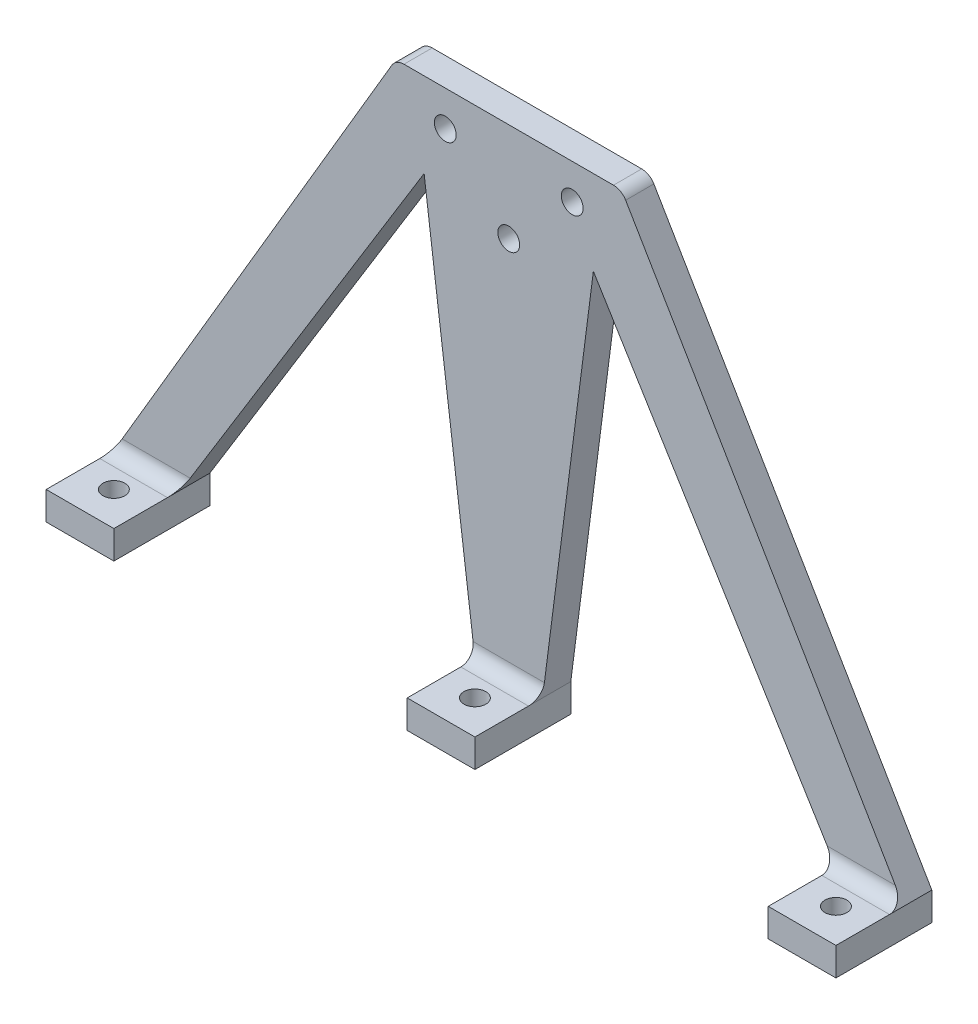
ISO-10303-21;
HEADER;
FILE_DESCRIPTION(('STEP AP214'),'2;1');
FILE_NAME('part.step','',(''),(''),'','','');
FILE_SCHEMA(('AUTOMOTIVE_DESIGN { 1 0 10303 214 1 1 1 1 }'));
ENDSEC;
DATA;
#1=APPLICATION_CONTEXT('core data for automotive mechanical design processes');
#2=APPLICATION_PROTOCOL_DEFINITION('international standard','automotive_design',2000,#1);
#3=PRODUCT_CONTEXT('',#1,'mechanical');
#4=PRODUCT('Part','Part','',(#3));
#5=PRODUCT_RELATED_PRODUCT_CATEGORY('part','',(#4));
#6=PRODUCT_DEFINITION_FORMATION('','',#4);
#7=PRODUCT_DEFINITION_CONTEXT('part definition',#1,'design');
#8=PRODUCT_DEFINITION('design','',#6,#7);
#9=PRODUCT_DEFINITION_SHAPE('','',#8);
#10=(LENGTH_UNIT() NAMED_UNIT(*) SI_UNIT(.MILLI.,.METRE.));
#11=(NAMED_UNIT(*) PLANE_ANGLE_UNIT() SI_UNIT($,.RADIAN.));
#12=(NAMED_UNIT(*) SI_UNIT($,.STERADIAN.) SOLID_ANGLE_UNIT());
#13=UNCERTAINTY_MEASURE_WITH_UNIT(LENGTH_MEASURE(1.E-05),#10,'distance_accuracy_value','');
#14=(GEOMETRIC_REPRESENTATION_CONTEXT(3) GLOBAL_UNCERTAINTY_ASSIGNED_CONTEXT((#13)) GLOBAL_UNIT_ASSIGNED_CONTEXT((#10,
#11,#12)) REPRESENTATION_CONTEXT('',''));
#15=CARTESIAN_POINT('',(0.,0.,0.));
#16=DIRECTION('',(0.,0.,1.));
#17=DIRECTION('',(1.,0.,0.));
#18=AXIS2_PLACEMENT_3D('',#15,#16,#17);
#19=CARTESIAN_POINT('',(0.,-72.,4.));
#20=DIRECTION('',(0.,1.,0.));
#21=DIRECTION('',(0.,0.,1.));
#22=AXIS2_PLACEMENT_3D('',#19,#20,#21);
#23=PLANE('',#22);
#24=CARTESIAN_POINT('',(56.,-72.,8.8));
#25=DIRECTION('',(0.,1.,0.));
#26=DIRECTION('',(0.,0.,1.));
#27=AXIS2_PLACEMENT_3D('',#24,#25,#26);
#28=CIRCLE('',#27,1.54999999999999);
#29=CARTESIAN_POINT('',(56.,-72.,10.35));
#30=VERTEX_POINT('',#29);
#31=EDGE_CURVE('E263',#30,#30,#28,.T.);
#32=ORIENTED_EDGE('',*,*,#31,.T.);
#33=EDGE_LOOP('',(#32));
#34=FACE_BOUND('',#33,.T.);
#35=DIRECTION('',(1.,0.,0.));
#36=VECTOR('',#35,1.);
#37=CARTESIAN_POINT('',(0.,-72.,0.));
#38=LINE('',#37,#36);
#39=CARTESIAN_POINT('',(51.2,-72.,0.));
#40=VERTEX_POINT('',#39);
#41=CARTESIAN_POINT('',(60.8,-72.,0.));
#42=VERTEX_POINT('',#41);
#43=EDGE_CURVE('E344',#40,#42,#38,.T.);
#44=ORIENTED_EDGE('',*,*,#43,.T.);
#45=DIRECTION('',(0.,0.,-1.));
#46=VECTOR('',#45,1.);
#47=CARTESIAN_POINT('',(60.8,-72.,13.6));
#48=LINE('',#47,#46);
#49=CARTESIAN_POINT('',(60.8,-72.,13.6));
#50=VERTEX_POINT('',#49);
#51=EDGE_CURVE('E293',#50,#42,#48,.T.);
#52=ORIENTED_EDGE('',*,*,#51,.F.);
#53=DIRECTION('',(1.,0.,0.));
#54=VECTOR('',#53,1.);
#55=CARTESIAN_POINT('',(51.2,-72.,13.6));
#56=LINE('',#55,#54);
#57=CARTESIAN_POINT('',(51.2,-72.,13.6));
#58=VERTEX_POINT('',#57);
#59=EDGE_CURVE('E281',#58,#50,#56,.T.);
#60=ORIENTED_EDGE('',*,*,#59,.F.);
#61=DIRECTION('',(0.,0.,-1.));
#62=VECTOR('',#61,1.);
#63=CARTESIAN_POINT('',(51.2,-72.,13.6));
#64=LINE('',#63,#62);
#65=EDGE_CURVE('E295',#58,#40,#64,.T.);
#66=ORIENTED_EDGE('',*,*,#65,.T.);
#67=EDGE_LOOP('',(#44,#52,#60,#66));
#68=FACE_BOUND('',#67,.T.);
#69=ADVANCED_FACE('F33',(#34,#68),#23,.F.);
#70=CARTESIAN_POINT('',(4.80000000000001,-72.,8.8));
#71=DIRECTION('',(0.,1.,0.));
#72=DIRECTION('',(0.,0.,1.));
#73=AXIS2_PLACEMENT_3D('',#70,#71,#72);
#74=CIRCLE('',#73,1.55);
#75=CARTESIAN_POINT('',(4.80000000000001,-72.,10.35));
#76=VERTEX_POINT('',#75);
#77=EDGE_CURVE('E275',#76,#76,#74,.T.);
#78=ORIENTED_EDGE('',*,*,#77,.T.);
#79=EDGE_LOOP('',(#78));
#80=FACE_BOUND('',#79,.T.);
#81=CARTESIAN_POINT('',(0.,-72.,0.));
#82=VERTEX_POINT('',#81);
#83=CARTESIAN_POINT('',(9.60000000000001,-72.,0.));
#84=VERTEX_POINT('',#83);
#85=EDGE_CURVE('E340',#82,#84,#38,.T.);
#86=ORIENTED_EDGE('',*,*,#85,.T.);
#87=DIRECTION('',(0.,0.,-1.));
#88=VECTOR('',#87,1.);
#89=CARTESIAN_POINT('',(9.60000000000001,-72.,13.6));
#90=LINE('',#89,#88);
#91=CARTESIAN_POINT('',(9.60000000000001,-72.,13.6));
#92=VERTEX_POINT('',#91);
#93=EDGE_CURVE('E330',#92,#84,#90,.T.);
#94=ORIENTED_EDGE('',*,*,#93,.F.);
#95=DIRECTION('',(1.,0.,0.));
#96=VECTOR('',#95,1.);
#97=CARTESIAN_POINT('',(0.,-72.,13.6));
#98=LINE('',#97,#96);
#99=CARTESIAN_POINT('',(0.,-72.,13.6));
#100=VERTEX_POINT('',#99);
#101=EDGE_CURVE('E318',#100,#92,#98,.T.);
#102=ORIENTED_EDGE('',*,*,#101,.F.);
#103=DIRECTION('',(0.,0.,-1.));
#104=VECTOR('',#103,1.);
#105=CARTESIAN_POINT('',(0.,-72.,4.));
#106=LINE('',#105,#104);
#107=EDGE_CURVE('E350',#100,#82,#106,.T.);
#108=ORIENTED_EDGE('',*,*,#107,.T.);
#109=EDGE_LOOP('',(#86,#94,#102,#108));
#110=FACE_BOUND('',#109,.T.);
#111=ADVANCED_FACE('F517',(#80,#110),#23,.F.);
#112=CARTESIAN_POINT('',(0.,0.,4.));
#113=DIRECTION('',(0.,0.,1.));
#114=DIRECTION('',(1.,0.,0.));
#115=AXIS2_PLACEMENT_3D('',#112,#113,#114);
#116=PLANE('',#115);
#117=DIRECTION('',(0.507020126563394,-0.861934215157769,0.));
#118=VECTOR('',#117,1.);
#119=CARTESIAN_POINT('',(72.,0.,4.));
#120=LINE('',#119,#118);
#121=CARTESIAN_POINT('',(72.5799763216901,-0.985959746873217,4.));
#122=VERTEX_POINT('',#121);
#123=CARTESIAN_POINT('',(110.823529411765,-66.,4.));
#124=VERTEX_POINT('',#123);
#125=EDGE_CURVE('E236',#122,#124,#120,.T.);
#126=ORIENTED_EDGE('',*,*,#125,.F.);
#127=CARTESIAN_POINT('',(70.8561078913746,-2.,4.));
#128=DIRECTION('',(0.,0.,1.));
#129=DIRECTION('',(1.,0.,0.));
#130=AXIS2_PLACEMENT_3D('',#127,#128,#129);
#131=CIRCLE('',#130,2.);
#132=CARTESIAN_POINT('',(70.8561078913746,0.,4.));
#133=VERTEX_POINT('',#132);
#134=EDGE_CURVE('E416',#122,#133,#131,.T.);
#135=ORIENTED_EDGE('',*,*,#134,.T.);
#136=DIRECTION('',(-1.,0.,0.));
#137=VECTOR('',#136,1.);
#138=CARTESIAN_POINT('',(0.,0.,4.));
#139=LINE('',#138,#137);
#140=CARTESIAN_POINT('',(41.1438921086254,0.,4.));
#141=VERTEX_POINT('',#140);
#142=EDGE_CURVE('E333',#133,#141,#139,.T.);
#143=ORIENTED_EDGE('',*,*,#142,.T.);
#144=CARTESIAN_POINT('',(41.1438921086254,-2.,4.));
#145=DIRECTION('',(0.,0.,1.));
#146=DIRECTION('',(1.,0.,0.));
#147=AXIS2_PLACEMENT_3D('',#144,#145,#146);
#148=CIRCLE('',#147,2.);
#149=CARTESIAN_POINT('',(39.4200236783099,-0.98595974687321,4.));
#150=VERTEX_POINT('',#149);
#151=EDGE_CURVE('E414',#141,#150,#148,.T.);
#152=ORIENTED_EDGE('',*,*,#151,.T.);
#153=DIRECTION('',(0.507020126563394,0.86193421515777,0.));
#154=VECTOR('',#153,1.);
#155=CARTESIAN_POINT('',(40.,0.,4.));
#156=LINE('',#155,#154);
#157=CARTESIAN_POINT('',(1.1764705882353,-66.,4.));
#158=VERTEX_POINT('',#157);
#159=EDGE_CURVE('E244',#158,#150,#156,.T.);
#160=ORIENTED_EDGE('',*,*,#159,.F.);
#161=DIRECTION('',(-1.,0.,0.));
#162=VECTOR('',#161,1.);
#163=CARTESIAN_POINT('',(0.,-66.,4.));
#164=LINE('',#163,#162);
#165=CARTESIAN_POINT('',(10.8285714285714,-66.,4.));
#166=VERTEX_POINT('',#165);
#167=EDGE_CURVE('E387',#158,#166,#164,.F.);
#168=ORIENTED_EDGE('',*,*,#167,.T.);
#169=DIRECTION('',(-0.523418105874801,-0.852075986307815,0.));
#170=VECTOR('',#169,1.);
#171=CARTESIAN_POINT('',(9.60000000000001,-68.,4.));
#172=LINE('',#171,#170);
#173=CARTESIAN_POINT('',(44.,-12.,4.));
#174=VERTEX_POINT('',#173);
#175=EDGE_CURVE('E230',#174,#166,#172,.T.);
#176=ORIENTED_EDGE('',*,*,#175,.F.);
#177=DIRECTION('',(-0.127521742539526,0.991835775307426,0.));
#178=VECTOR('',#177,1.);
#179=CARTESIAN_POINT('',(44.,-12.,4.));
#180=LINE('',#179,#178);
#181=CARTESIAN_POINT('',(50.9428571428572,-66.,4.));
#182=VERTEX_POINT('',#181);
#183=EDGE_CURVE('E227',#182,#174,#180,.T.);
#184=ORIENTED_EDGE('',*,*,#183,.F.);
#185=DIRECTION('',(-1.,0.,0.));
#186=VECTOR('',#185,1.);
#187=CARTESIAN_POINT('',(0.,-66.,4.));
#188=LINE('',#187,#186);
#189=CARTESIAN_POINT('',(61.0571428571429,-66.,4.));
#190=VERTEX_POINT('',#189);
#191=EDGE_CURVE('E223',#182,#190,#188,.F.);
#192=ORIENTED_EDGE('',*,*,#191,.T.);
#193=DIRECTION('',(-0.127521742539526,-0.991835775307426,0.));
#194=VECTOR('',#193,1.);
#195=CARTESIAN_POINT('',(68.,-12.,4.));
#196=LINE('',#195,#194);
#197=CARTESIAN_POINT('',(68.,-12.,4.));
#198=VERTEX_POINT('',#197);
#199=EDGE_CURVE('E205',#198,#190,#196,.T.);
#200=ORIENTED_EDGE('',*,*,#199,.F.);
#201=DIRECTION('',(-0.523418105874801,0.852075986307815,0.));
#202=VECTOR('',#201,1.);
#203=CARTESIAN_POINT('',(102.4,-68.,4.));
#204=LINE('',#203,#202);
#205=CARTESIAN_POINT('',(101.171428571429,-66.,4.));
#206=VERTEX_POINT('',#205);
#207=EDGE_CURVE('E194',#206,#198,#204,.T.);
#208=ORIENTED_EDGE('',*,*,#207,.F.);
#209=DIRECTION('',(-1.,0.,0.));
#210=VECTOR('',#209,1.);
#211=CARTESIAN_POINT('',(0.,-66.,4.));
#212=LINE('',#211,#210);
#213=EDGE_CURVE('E390',#206,#124,#212,.F.);
#214=ORIENTED_EDGE('',*,*,#213,.T.);
#215=EDGE_LOOP('',(#126,#135,#143,#152,#160,#168,#176,#184,#192,#200,#208,#214));
#216=FACE_BOUND('',#215,.T.);
#217=CARTESIAN_POINT('',(65.,-5.00000000000001,4.));
#218=DIRECTION('',(0.,0.,1.));
#219=DIRECTION('',(1.,0.,0.));
#220=AXIS2_PLACEMENT_3D('',#217,#218,#219);
#221=CIRCLE('',#220,1.54999999999999);
#222=CARTESIAN_POINT('',(66.55,-5.00000000000001,4.));
#223=VERTEX_POINT('',#222);
#224=EDGE_CURVE('E249',#223,#223,#221,.T.);
#225=ORIENTED_EDGE('',*,*,#224,.F.);
#226=EDGE_LOOP('',(#225));
#227=FACE_BOUND('',#226,.T.);
#228=CARTESIAN_POINT('',(56.,-14.,4.));
#229=DIRECTION('',(0.,0.,1.));
#230=DIRECTION('',(1.,0.,0.));
#231=AXIS2_PLACEMENT_3D('',#228,#229,#230);
#232=CIRCLE('',#231,1.55);
#233=CARTESIAN_POINT('',(57.55,-14.,4.));
#234=VERTEX_POINT('',#233);
#235=EDGE_CURVE('E248',#234,#234,#232,.T.);
#236=ORIENTED_EDGE('',*,*,#235,.F.);
#237=EDGE_LOOP('',(#236));
#238=FACE_BOUND('',#237,.T.);
#239=CARTESIAN_POINT('',(47.,-5.00000000000001,4.));
#240=DIRECTION('',(0.,0.,1.));
#241=DIRECTION('',(1.,0.,0.));
#242=AXIS2_PLACEMENT_3D('',#239,#240,#241);
#243=CIRCLE('',#242,1.55);
#244=CARTESIAN_POINT('',(48.55,-5.00000000000001,4.));
#245=VERTEX_POINT('',#244);
#246=EDGE_CURVE('E255',#245,#245,#243,.T.);
#247=ORIENTED_EDGE('',*,*,#246,.F.);
#248=EDGE_LOOP('',(#247));
#249=FACE_BOUND('',#248,.T.);
#250=ADVANCED_FACE('F219',(#216,#227,#238,#249),#116,.T.);
#251=CARTESIAN_POINT('',(0.,0.,4.));
#252=DIRECTION('',(1.,0.,0.));
#253=DIRECTION('',(0.,1.,0.));
#254=AXIS2_PLACEMENT_3D('',#251,#252,#253);
#255=PLANE('',#254);
#256=DIRECTION('',(0.,0.,-1.));
#257=VECTOR('',#256,1.);
#258=CARTESIAN_POINT('',(0.,-68.,13.6));
#259=LINE('',#258,#257);
#260=CARTESIAN_POINT('',(0.,-68.,13.6));
#261=VERTEX_POINT('',#260);
#262=CARTESIAN_POINT('',(0.,-68.,6.));
#263=VERTEX_POINT('',#262);
#264=EDGE_CURVE('E324',#261,#263,#259,.T.);
#265=ORIENTED_EDGE('',*,*,#264,.T.);
#266=DIRECTION('',(0.,0.,1.));
#267=VECTOR('',#266,1.);
#268=CARTESIAN_POINT('',(0.,-68.,-5.6));
#269=LINE('',#268,#267);
#270=CARTESIAN_POINT('',(0.,-68.,0.));
#271=VERTEX_POINT('',#270);
#272=EDGE_CURVE('E246',#271,#263,#269,.T.);
#273=ORIENTED_EDGE('',*,*,#272,.F.);
#274=DIRECTION('',(0.,-1.,0.));
#275=VECTOR('',#274,1.);
#276=CARTESIAN_POINT('',(0.,0.,0.));
#277=LINE('',#276,#275);
#278=EDGE_CURVE('E332',#271,#82,#277,.T.);
#279=ORIENTED_EDGE('',*,*,#278,.T.);
#280=ORIENTED_EDGE('',*,*,#107,.F.);
#281=DIRECTION('',(0.,-1.,0.));
#282=VECTOR('',#281,1.);
#283=CARTESIAN_POINT('',(0.,-72.,13.6));
#284=LINE('',#283,#282);
#285=EDGE_CURVE('E315',#261,#100,#284,.T.);
#286=ORIENTED_EDGE('',*,*,#285,.F.);
#287=EDGE_LOOP('',(#265,#273,#279,#280,#286));
#288=FACE_BOUND('',#287,.T.);
#289=ADVANCED_FACE('F455',(#288),#255,.F.);
#290=CARTESIAN_POINT('',(107.2,-72.,8.8));
#291=DIRECTION('',(0.,1.,0.));
#292=DIRECTION('',(0.,0.,1.));
#293=AXIS2_PLACEMENT_3D('',#290,#291,#292);
#294=CIRCLE('',#293,1.54999999999999);
#295=CARTESIAN_POINT('',(107.2,-72.,10.35));
#296=VERTEX_POINT('',#295);
#297=EDGE_CURVE('E269',#296,#296,#294,.T.);
#298=ORIENTED_EDGE('',*,*,#297,.T.);
#299=EDGE_LOOP('',(#298));
#300=FACE_BOUND('',#299,.T.);
#301=DIRECTION('',(0.,0.,-1.));
#302=VECTOR('',#301,1.);
#303=CARTESIAN_POINT('',(102.4,-72.,13.6));
#304=LINE('',#303,#302);
#305=CARTESIAN_POINT('',(102.4,-72.,13.6));
#306=VERTEX_POINT('',#305);
#307=CARTESIAN_POINT('',(102.4,-72.,0.));
#308=VERTEX_POINT('',#307);
#309=EDGE_CURVE('E313',#306,#308,#304,.T.);
#310=ORIENTED_EDGE('',*,*,#309,.T.);
#311=CARTESIAN_POINT('',(112.,-72.,0.));
#312=VERTEX_POINT('',#311);
#313=EDGE_CURVE('E339',#308,#312,#38,.T.);
#314=ORIENTED_EDGE('',*,*,#313,.T.);
#315=DIRECTION('',(0.,0.,-1.));
#316=VECTOR('',#315,1.);
#317=CARTESIAN_POINT('',(112.,-72.,4.));
#318=LINE('',#317,#316);
#319=CARTESIAN_POINT('',(112.,-72.,13.6));
#320=VERTEX_POINT('',#319);
#321=EDGE_CURVE('E336',#320,#312,#318,.T.);
#322=ORIENTED_EDGE('',*,*,#321,.F.);
#323=DIRECTION('',(1.,0.,0.));
#324=VECTOR('',#323,1.);
#325=CARTESIAN_POINT('',(102.4,-72.,13.6));
#326=LINE('',#325,#324);
#327=EDGE_CURVE('E300',#306,#320,#326,.T.);
#328=ORIENTED_EDGE('',*,*,#327,.F.);
#329=EDGE_LOOP('',(#310,#314,#322,#328));
#330=FACE_BOUND('',#329,.T.);
#331=ADVANCED_FACE('F520',(#300,#330),#23,.F.);
#332=CARTESIAN_POINT('',(112.,0.,4.));
#333=DIRECTION('',(-1.,0.,0.));
#334=DIRECTION('',(0.,-1.,0.));
#335=AXIS2_PLACEMENT_3D('',#332,#333,#334);
#336=PLANE('',#335);
#337=DIRECTION('',(0.,1.,0.));
#338=VECTOR('',#337,1.);
#339=CARTESIAN_POINT('',(112.,0.,0.));
#340=LINE('',#339,#338);
#341=CARTESIAN_POINT('',(112.,-68.0000000000001,0.));
#342=VERTEX_POINT('',#341);
#343=EDGE_CURVE('E343',#312,#342,#340,.T.);
#344=ORIENTED_EDGE('',*,*,#343,.T.);
#345=DIRECTION('',(0.,0.,1.));
#346=VECTOR('',#345,1.);
#347=CARTESIAN_POINT('',(112.,-68.,-5.6));
#348=LINE('',#347,#346);
#349=CARTESIAN_POINT('',(112.,-68.,6.));
#350=VERTEX_POINT('',#349);
#351=EDGE_CURVE('E242',#342,#350,#348,.T.);
#352=ORIENTED_EDGE('',*,*,#351,.T.);
#353=DIRECTION('',(0.,0.,-1.));
#354=VECTOR('',#353,1.);
#355=CARTESIAN_POINT('',(112.,-68.,13.6));
#356=LINE('',#355,#354);
#357=CARTESIAN_POINT('',(112.,-68.,13.6));
#358=VERTEX_POINT('',#357);
#359=EDGE_CURVE('E310',#358,#350,#356,.T.);
#360=ORIENTED_EDGE('',*,*,#359,.F.);
#361=DIRECTION('',(0.,1.,0.));
#362=VECTOR('',#361,1.);
#363=CARTESIAN_POINT('',(112.,-72.,13.6));
#364=LINE('',#363,#362);
#365=EDGE_CURVE('E303',#320,#358,#364,.T.);
#366=ORIENTED_EDGE('',*,*,#365,.F.);
#367=ORIENTED_EDGE('',*,*,#321,.T.);
#368=EDGE_LOOP('',(#344,#352,#360,#366,#367));
#369=FACE_BOUND('',#368,.T.);
#370=ADVANCED_FACE('F528',(#369),#336,.F.);
#371=CARTESIAN_POINT('',(0.,0.,4.));
#372=DIRECTION('',(0.,-1.,0.));
#373=DIRECTION('',(0.,0.,-1.));
#374=AXIS2_PLACEMENT_3D('',#371,#372,#373);
#375=PLANE('',#374);
#376=ORIENTED_EDGE('',*,*,#142,.F.);
#377=DIRECTION('',(0.,0.,1.));
#378=VECTOR('',#377,1.);
#379=CARTESIAN_POINT('',(70.8561078913746,0.,4.));
#380=LINE('',#379,#378);
#381=CARTESIAN_POINT('',(70.8561078913746,0.,0.));
#382=VERTEX_POINT('',#381);
#383=EDGE_CURVE('E421',#133,#382,#380,.F.);
#384=ORIENTED_EDGE('',*,*,#383,.T.);
#385=DIRECTION('',(-1.,0.,0.));
#386=VECTOR('',#385,1.);
#387=CARTESIAN_POINT('',(0.,0.,0.));
#388=LINE('',#387,#386);
#389=CARTESIAN_POINT('',(41.1438921086254,0.,0.));
#390=VERTEX_POINT('',#389);
#391=EDGE_CURVE('E337',#382,#390,#388,.T.);
#392=ORIENTED_EDGE('',*,*,#391,.T.);
#393=DIRECTION('',(0.,0.,1.));
#394=VECTOR('',#393,1.);
#395=CARTESIAN_POINT('',(41.1438921086254,0.,4.));
#396=LINE('',#395,#394);
#397=EDGE_CURVE('E418',#390,#141,#396,.T.);
#398=ORIENTED_EDGE('',*,*,#397,.T.);
#399=EDGE_LOOP('',(#376,#384,#392,#398));
#400=FACE_BOUND('',#399,.T.);
#401=ADVANCED_FACE('F436',(#400),#375,.F.);
#402=CARTESIAN_POINT('',(0.,0.,0.));
#403=DIRECTION('',(0.,0.,1.));
#404=DIRECTION('',(1.,0.,0.));
#405=AXIS2_PLACEMENT_3D('',#402,#403,#404);
#406=PLANE('',#405);
#407=CARTESIAN_POINT('',(65.,-5.00000000000001,0.));
#408=DIRECTION('',(0.,0.,1.));
#409=DIRECTION('',(1.,0.,0.));
#410=AXIS2_PLACEMENT_3D('',#407,#408,#409);
#411=CIRCLE('',#410,1.54999999999999);
#412=CARTESIAN_POINT('',(66.55,-5.00000000000001,0.));
#413=VERTEX_POINT('',#412);
#414=EDGE_CURVE('E259',#413,#413,#411,.T.);
#415=ORIENTED_EDGE('',*,*,#414,.T.);
#416=EDGE_LOOP('',(#415));
#417=FACE_BOUND('',#416,.T.);
#418=CARTESIAN_POINT('',(56.,-14.,0.));
#419=DIRECTION('',(0.,0.,1.));
#420=DIRECTION('',(1.,0.,0.));
#421=AXIS2_PLACEMENT_3D('',#418,#419,#420);
#422=CIRCLE('',#421,1.55);
#423=CARTESIAN_POINT('',(57.55,-14.,0.));
#424=VERTEX_POINT('',#423);
#425=EDGE_CURVE('E252',#424,#424,#422,.T.);
#426=ORIENTED_EDGE('',*,*,#425,.T.);
#427=EDGE_LOOP('',(#426));
#428=FACE_BOUND('',#427,.T.);
#429=CARTESIAN_POINT('',(47.,-5.00000000000001,0.));
#430=DIRECTION('',(0.,0.,1.));
#431=DIRECTION('',(1.,0.,0.));
#432=AXIS2_PLACEMENT_3D('',#429,#430,#431);
#433=CIRCLE('',#432,1.55);
#434=CARTESIAN_POINT('',(48.55,-5.00000000000001,0.));
#435=VERTEX_POINT('',#434);
#436=EDGE_CURVE('E258',#435,#435,#433,.T.);
#437=ORIENTED_EDGE('',*,*,#436,.T.);
#438=EDGE_LOOP('',(#437));
#439=FACE_BOUND('',#438,.T.);
#440=ORIENTED_EDGE('',*,*,#391,.F.);
#441=CARTESIAN_POINT('',(70.8561078913746,-2.,0.));
#442=DIRECTION('',(0.,0.,1.));
#443=DIRECTION('',(1.,0.,0.));
#444=AXIS2_PLACEMENT_3D('',#441,#442,#443);
#445=CIRCLE('',#444,2.);
#446=CARTESIAN_POINT('',(72.5799763216901,-0.985959746873238,0.));
#447=VERTEX_POINT('',#446);
#448=EDGE_CURVE('E41',#382,#447,#445,.F.);
#449=ORIENTED_EDGE('',*,*,#448,.T.);
#450=DIRECTION('',(0.507020126563394,-0.86193421515777,0.));
#451=VECTOR('',#450,1.);
#452=CARTESIAN_POINT('',(53.4910025706941,31.46529562982,0.));
#453=LINE('',#452,#451);
#454=EDGE_CURVE('E361',#447,#342,#453,.T.);
#455=ORIENTED_EDGE('',*,*,#454,.T.);
#456=ORIENTED_EDGE('',*,*,#343,.F.);
#457=ORIENTED_EDGE('',*,*,#313,.F.);
#458=DIRECTION('',(0.,1.,0.));
#459=VECTOR('',#458,1.);
#460=CARTESIAN_POINT('',(102.4,0.,0.));
#461=LINE('',#460,#459);
#462=CARTESIAN_POINT('',(102.4,-68.,0.));
#463=VERTEX_POINT('',#462);
#464=EDGE_CURVE('E375',#308,#463,#461,.T.);
#465=ORIENTED_EDGE('',*,*,#464,.T.);
#466=DIRECTION('',(-0.523418105874801,0.852075986307815,0.));
#467=VECTOR('',#466,1.);
#468=CARTESIAN_POINT('',(44.01837309231,27.0398577567047,0.));
#469=LINE('',#468,#467);
#470=CARTESIAN_POINT('',(68.,-12.,0.));
#471=VERTEX_POINT('',#470);
#472=EDGE_CURVE('E378',#463,#471,#469,.T.);
#473=ORIENTED_EDGE('',*,*,#472,.T.);
#474=DIRECTION('',(-0.127521742539526,-0.991835775307426,0.));
#475=VECTOR('',#474,1.);
#476=CARTESIAN_POINT('',(68.4119654687814,-8.79582413170046,0.));
#477=LINE('',#476,#475);
#478=CARTESIAN_POINT('',(60.8,-68.,0.));
#479=VERTEX_POINT('',#478);
#480=EDGE_CURVE('E214',#471,#479,#477,.T.);
#481=ORIENTED_EDGE('',*,*,#480,.T.);
#482=DIRECTION('',(0.,-1.,0.));
#483=VECTOR('',#482,1.);
#484=CARTESIAN_POINT('',(60.8,0.,0.));
#485=LINE('',#484,#483);
#486=EDGE_CURVE('E381',#479,#42,#485,.T.);
#487=ORIENTED_EDGE('',*,*,#486,.T.);
#488=ORIENTED_EDGE('',*,*,#43,.F.);
#489=DIRECTION('',(0.,1.,0.));
#490=VECTOR('',#489,1.);
#491=CARTESIAN_POINT('',(51.2,0.,0.));
#492=LINE('',#491,#490);
#493=CARTESIAN_POINT('',(51.2,-68.,0.));
#494=VERTEX_POINT('',#493);
#495=EDGE_CURVE('E363',#40,#494,#492,.T.);
#496=ORIENTED_EDGE('',*,*,#495,.T.);
#497=DIRECTION('',(-0.127521742539526,0.991835775307426,0.));
#498=VECTOR('',#497,1.);
#499=CARTESIAN_POINT('',(41.7667135113431,5.37000602288697,0.));
#500=LINE('',#499,#498);
#501=CARTESIAN_POINT('',(44.,-12.,0.));
#502=VERTEX_POINT('',#501);
#503=EDGE_CURVE('E366',#494,#502,#500,.T.);
#504=ORIENTED_EDGE('',*,*,#503,.T.);
#505=DIRECTION('',(-0.523418105874801,-0.852075986307815,0.));
#506=VECTOR('',#505,1.);
#507=CARTESIAN_POINT('',(37.2973773892429,-22.9112461105349,0.));
#508=LINE('',#507,#506);
#509=CARTESIAN_POINT('',(9.60000000000001,-68.,0.));
#510=VERTEX_POINT('',#509);
#511=EDGE_CURVE('E369',#502,#510,#508,.T.);
#512=ORIENTED_EDGE('',*,*,#511,.T.);
#513=DIRECTION('',(0.,-1.,0.));
#514=VECTOR('',#513,1.);
#515=CARTESIAN_POINT('',(9.60000000000001,0.,0.));
#516=LINE('',#515,#514);
#517=EDGE_CURVE('E372',#510,#84,#516,.T.);
#518=ORIENTED_EDGE('',*,*,#517,.T.);
#519=ORIENTED_EDGE('',*,*,#85,.F.);
#520=ORIENTED_EDGE('',*,*,#278,.F.);
#521=DIRECTION('',(0.507020126563394,0.86193421515777,0.));
#522=VECTOR('',#521,1.);
#523=CARTESIAN_POINT('',(29.7172236503856,-17.4807197943445,0.));
#524=LINE('',#523,#522);
#525=CARTESIAN_POINT('',(39.4200236783099,-0.9859597468732,0.));
#526=VERTEX_POINT('',#525);
#527=EDGE_CURVE('E353',#271,#526,#524,.T.);
#528=ORIENTED_EDGE('',*,*,#527,.T.);
#529=CARTESIAN_POINT('',(41.1438921086254,-2.,0.));
#530=DIRECTION('',(0.,0.,1.));
#531=DIRECTION('',(1.,0.,0.));
#532=AXIS2_PLACEMENT_3D('',#529,#530,#531);
#533=CIRCLE('',#532,2.);
#534=EDGE_CURVE('E53',#526,#390,#533,.F.);
#535=ORIENTED_EDGE('',*,*,#534,.T.);
#536=EDGE_LOOP('',(#440,#449,#455,#456,#457,#465,#473,#481,#487,#488,#496,#504,#512,#518,#519,
#520,#528,#535));
#537=FACE_BOUND('',#536,.T.);
#538=ADVANCED_FACE('F425',(#417,#428,#439,#537),#406,.F.);
#539=CARTESIAN_POINT('',(9.60000000000001,-72.,13.6));
#540=DIRECTION('',(-1.,0.,0.));
#541=DIRECTION('',(0.,0.,1.));
#542=AXIS2_PLACEMENT_3D('',#539,#540,#541);
#543=PLANE('',#542);
#544=ORIENTED_EDGE('',*,*,#93,.T.);
#545=ORIENTED_EDGE('',*,*,#517,.F.);
#546=DIRECTION('',(0.,0.,1.));
#547=VECTOR('',#546,1.);
#548=CARTESIAN_POINT('',(9.60000000000001,-68.,-5.6));
#549=LINE('',#548,#547);
#550=CARTESIAN_POINT('',(9.60000000000001,-68.,6.));
#551=VERTEX_POINT('',#550);
#552=EDGE_CURVE('E234',#510,#551,#549,.T.);
#553=ORIENTED_EDGE('',*,*,#552,.T.);
#554=DIRECTION('',(0.,0.,-1.));
#555=VECTOR('',#554,1.);
#556=CARTESIAN_POINT('',(9.60000000000001,-68.,13.6));
#557=LINE('',#556,#555);
#558=CARTESIAN_POINT('',(9.60000000000001,-68.,13.6));
#559=VERTEX_POINT('',#558);
#560=EDGE_CURVE('E327',#559,#551,#557,.T.);
#561=ORIENTED_EDGE('',*,*,#560,.F.);
#562=DIRECTION('',(0.,1.,0.));
#563=VECTOR('',#562,1.);
#564=CARTESIAN_POINT('',(9.60000000000001,-72.,13.6));
#565=LINE('',#564,#563);
#566=EDGE_CURVE('E320',#92,#559,#565,.T.);
#567=ORIENTED_EDGE('',*,*,#566,.F.);
#568=EDGE_LOOP('',(#544,#545,#553,#561,#567));
#569=FACE_BOUND('',#568,.T.);
#570=ADVANCED_FACE('F463',(#569),#543,.F.);
#571=CARTESIAN_POINT('',(0.,-68.,13.6));
#572=DIRECTION('',(0.,-1.,0.));
#573=DIRECTION('',(0.,0.,-1.));
#574=AXIS2_PLACEMENT_3D('',#571,#572,#573);
#575=PLANE('',#574);
#576=CARTESIAN_POINT('',(4.80000000000001,-68.,8.8));
#577=DIRECTION('',(0.,1.,0.));
#578=DIRECTION('',(0.,0.,1.));
#579=AXIS2_PLACEMENT_3D('',#576,#577,#578);
#580=CIRCLE('',#579,1.55);
#581=CARTESIAN_POINT('',(4.80000000000001,-68.,10.35));
#582=VERTEX_POINT('',#581);
#583=EDGE_CURVE('E272',#582,#582,#580,.T.);
#584=ORIENTED_EDGE('',*,*,#583,.F.);
#585=EDGE_LOOP('',(#584));
#586=FACE_BOUND('',#585,.T.);
#587=ORIENTED_EDGE('',*,*,#560,.T.);
#588=DIRECTION('',(-1.,0.,0.));
#589=VECTOR('',#588,1.);
#590=CARTESIAN_POINT('',(0.,-68.,6.));
#591=LINE('',#590,#589);
#592=EDGE_CURVE('E395',#551,#263,#591,.T.);
#593=ORIENTED_EDGE('',*,*,#592,.T.);
#594=ORIENTED_EDGE('',*,*,#264,.F.);
#595=DIRECTION('',(-1.,0.,0.));
#596=VECTOR('',#595,1.);
#597=CARTESIAN_POINT('',(0.,-68.,13.6));
#598=LINE('',#597,#596);
#599=EDGE_CURVE('E322',#559,#261,#598,.T.);
#600=ORIENTED_EDGE('',*,*,#599,.F.);
#601=EDGE_LOOP('',(#587,#593,#594,#600));
#602=FACE_BOUND('',#601,.T.);
#603=ADVANCED_FACE('F450',(#586,#602),#575,.F.);
#604=CARTESIAN_POINT('',(0.,0.,13.6));
#605=DIRECTION('',(0.,0.,-1.));
#606=DIRECTION('',(-1.,0.,0.));
#607=AXIS2_PLACEMENT_3D('',#604,#605,#606);
#608=PLANE('',#607);
#609=ORIENTED_EDGE('',*,*,#285,.T.);
#610=ORIENTED_EDGE('',*,*,#101,.T.);
#611=ORIENTED_EDGE('',*,*,#566,.T.);
#612=ORIENTED_EDGE('',*,*,#599,.T.);
#613=EDGE_LOOP('',(#609,#610,#611,#612));
#614=FACE_BOUND('',#613,.T.);
#615=ADVANCED_FACE('F459',(#614),#608,.F.);
#616=CARTESIAN_POINT('',(102.4,-72.,13.6));
#617=DIRECTION('',(1.,0.,0.));
#618=DIRECTION('',(0.,0.,-1.));
#619=AXIS2_PLACEMENT_3D('',#616,#617,#618);
#620=PLANE('',#619);
#621=DIRECTION('',(0.,0.,-1.));
#622=VECTOR('',#621,1.);
#623=CARTESIAN_POINT('',(102.4,-68.,13.6));
#624=LINE('',#623,#622);
#625=CARTESIAN_POINT('',(102.4,-68.,13.6));
#626=VERTEX_POINT('',#625);
#627=CARTESIAN_POINT('',(102.4,-68.,6.));
#628=VERTEX_POINT('',#627);
#629=EDGE_CURVE('E307',#626,#628,#624,.T.);
#630=ORIENTED_EDGE('',*,*,#629,.T.);
#631=DIRECTION('',(0.,0.,1.));
#632=VECTOR('',#631,1.);
#633=CARTESIAN_POINT('',(102.4,-68.,-5.6));
#634=LINE('',#633,#632);
#635=EDGE_CURVE('E216',#463,#628,#634,.T.);
#636=ORIENTED_EDGE('',*,*,#635,.F.);
#637=ORIENTED_EDGE('',*,*,#464,.F.);
#638=ORIENTED_EDGE('',*,*,#309,.F.);
#639=DIRECTION('',(0.,-1.,0.));
#640=VECTOR('',#639,1.);
#641=CARTESIAN_POINT('',(102.4,-72.,13.6));
#642=LINE('',#641,#640);
#643=EDGE_CURVE('E297',#626,#306,#642,.T.);
#644=ORIENTED_EDGE('',*,*,#643,.F.);
#645=EDGE_LOOP('',(#630,#636,#637,#638,#644));
#646=FACE_BOUND('',#645,.T.);
#647=ADVANCED_FACE('F494',(#646),#620,.F.);
#648=CARTESIAN_POINT('',(102.4,-68.,13.6));
#649=DIRECTION('',(0.,-1.,0.));
#650=DIRECTION('',(0.,0.,-1.));
#651=AXIS2_PLACEMENT_3D('',#648,#649,#650);
#652=PLANE('',#651);
#653=CARTESIAN_POINT('',(107.2,-68.,8.8));
#654=DIRECTION('',(0.,1.,0.));
#655=DIRECTION('',(0.,0.,1.));
#656=AXIS2_PLACEMENT_3D('',#653,#654,#655);
#657=CIRCLE('',#656,1.54999999999999);
#658=CARTESIAN_POINT('',(107.2,-68.,10.35));
#659=VERTEX_POINT('',#658);
#660=EDGE_CURVE('E264',#659,#659,#657,.T.);
#661=ORIENTED_EDGE('',*,*,#660,.F.);
#662=EDGE_LOOP('',(#661));
#663=FACE_BOUND('',#662,.T.);
#664=ORIENTED_EDGE('',*,*,#359,.T.);
#665=DIRECTION('',(-1.,0.,0.));
#666=VECTOR('',#665,1.);
#667=CARTESIAN_POINT('',(102.4,-68.,6.));
#668=LINE('',#667,#666);
#669=EDGE_CURVE('E384',#350,#628,#668,.T.);
#670=ORIENTED_EDGE('',*,*,#669,.T.);
#671=ORIENTED_EDGE('',*,*,#629,.F.);
#672=DIRECTION('',(-1.,0.,0.));
#673=VECTOR('',#672,1.);
#674=CARTESIAN_POINT('',(102.4,-68.,13.6));
#675=LINE('',#674,#673);
#676=EDGE_CURVE('E305',#358,#626,#675,.T.);
#677=ORIENTED_EDGE('',*,*,#676,.F.);
#678=EDGE_LOOP('',(#664,#670,#671,#677));
#679=FACE_BOUND('',#678,.T.);
#680=ADVANCED_FACE('F500',(#663,#679),#652,.F.);
#681=CARTESIAN_POINT('',(0.,0.,13.6));
#682=DIRECTION('',(0.,0.,-1.));
#683=DIRECTION('',(-1.,0.,0.));
#684=AXIS2_PLACEMENT_3D('',#681,#682,#683);
#685=PLANE('',#684);
#686=ORIENTED_EDGE('',*,*,#643,.T.);
#687=ORIENTED_EDGE('',*,*,#327,.T.);
#688=ORIENTED_EDGE('',*,*,#365,.T.);
#689=ORIENTED_EDGE('',*,*,#676,.T.);
#690=EDGE_LOOP('',(#686,#687,#688,#689));
#691=FACE_BOUND('',#690,.T.);
#692=ADVANCED_FACE('F541',(#691),#685,.F.);
#693=CARTESIAN_POINT('',(51.2,-72.,13.6));
#694=DIRECTION('',(1.,0.,0.));
#695=DIRECTION('',(0.,0.,-1.));
#696=AXIS2_PLACEMENT_3D('',#693,#694,#695);
#697=PLANE('',#696);
#698=DIRECTION('',(0.,0.,-1.));
#699=VECTOR('',#698,1.);
#700=CARTESIAN_POINT('',(51.2,-68.,13.6));
#701=LINE('',#700,#699);
#702=CARTESIAN_POINT('',(51.2,-68.,13.6));
#703=VERTEX_POINT('',#702);
#704=CARTESIAN_POINT('',(51.2,-68.,6.));
#705=VERTEX_POINT('',#704);
#706=EDGE_CURVE('E287',#703,#705,#701,.T.);
#707=ORIENTED_EDGE('',*,*,#706,.T.);
#708=DIRECTION('',(0.,0.,1.));
#709=VECTOR('',#708,1.);
#710=CARTESIAN_POINT('',(51.2,-68.,-5.6));
#711=LINE('',#710,#709);
#712=EDGE_CURVE('E233',#494,#705,#711,.T.);
#713=ORIENTED_EDGE('',*,*,#712,.F.);
#714=ORIENTED_EDGE('',*,*,#495,.F.);
#715=ORIENTED_EDGE('',*,*,#65,.F.);
#716=DIRECTION('',(0.,-1.,0.));
#717=VECTOR('',#716,1.);
#718=CARTESIAN_POINT('',(51.2,-72.,13.6));
#719=LINE('',#718,#717);
#720=EDGE_CURVE('E278',#703,#58,#719,.T.);
#721=ORIENTED_EDGE('',*,*,#720,.F.);
#722=EDGE_LOOP('',(#707,#713,#714,#715,#721));
#723=FACE_BOUND('',#722,.T.);
#724=ADVANCED_FACE('F476',(#723),#697,.F.);
#725=CARTESIAN_POINT('',(60.8,-72.,13.6));
#726=DIRECTION('',(-1.,0.,0.));
#727=DIRECTION('',(0.,0.,1.));
#728=AXIS2_PLACEMENT_3D('',#725,#726,#727);
#729=PLANE('',#728);
#730=ORIENTED_EDGE('',*,*,#51,.T.);
#731=ORIENTED_EDGE('',*,*,#486,.F.);
#732=DIRECTION('',(0.,0.,1.));
#733=VECTOR('',#732,1.);
#734=CARTESIAN_POINT('',(60.8,-68.,-5.6));
#735=LINE('',#734,#733);
#736=CARTESIAN_POINT('',(60.8,-68.,6.));
#737=VERTEX_POINT('',#736);
#738=EDGE_CURVE('E215',#479,#737,#735,.T.);
#739=ORIENTED_EDGE('',*,*,#738,.T.);
#740=DIRECTION('',(0.,0.,-1.));
#741=VECTOR('',#740,1.);
#742=CARTESIAN_POINT('',(60.8,-68.,13.6));
#743=LINE('',#742,#741);
#744=CARTESIAN_POINT('',(60.8,-68.,13.6));
#745=VERTEX_POINT('',#744);
#746=EDGE_CURVE('E290',#745,#737,#743,.T.);
#747=ORIENTED_EDGE('',*,*,#746,.F.);
#748=DIRECTION('',(0.,1.,0.));
#749=VECTOR('',#748,1.);
#750=CARTESIAN_POINT('',(60.8,-72.,13.6));
#751=LINE('',#750,#749);
#752=EDGE_CURVE('E283',#50,#745,#751,.T.);
#753=ORIENTED_EDGE('',*,*,#752,.F.);
#754=EDGE_LOOP('',(#730,#731,#739,#747,#753));
#755=FACE_BOUND('',#754,.T.);
#756=ADVANCED_FACE('F546',(#755),#729,.F.);
#757=CARTESIAN_POINT('',(51.2,-68.,13.6));
#758=DIRECTION('',(0.,-1.,0.));
#759=DIRECTION('',(0.,0.,-1.));
#760=AXIS2_PLACEMENT_3D('',#757,#758,#759);
#761=PLANE('',#760);
#762=CARTESIAN_POINT('',(56.,-68.,8.8));
#763=DIRECTION('',(0.,1.,0.));
#764=DIRECTION('',(0.,0.,1.));
#765=AXIS2_PLACEMENT_3D('',#762,#763,#764);
#766=CIRCLE('',#765,1.54999999999999);
#767=CARTESIAN_POINT('',(56.,-68.,10.35));
#768=VERTEX_POINT('',#767);
#769=EDGE_CURVE('E260',#768,#768,#766,.T.);
#770=ORIENTED_EDGE('',*,*,#769,.F.);
#771=EDGE_LOOP('',(#770));
#772=FACE_BOUND('',#771,.T.);
#773=ORIENTED_EDGE('',*,*,#746,.T.);
#774=DIRECTION('',(-1.,0.,0.));
#775=VECTOR('',#774,1.);
#776=CARTESIAN_POINT('',(51.2,-68.,6.));
#777=LINE('',#776,#775);
#778=EDGE_CURVE('E392',#737,#705,#777,.T.);
#779=ORIENTED_EDGE('',*,*,#778,.T.);
#780=ORIENTED_EDGE('',*,*,#706,.F.);
#781=DIRECTION('',(-1.,0.,0.));
#782=VECTOR('',#781,1.);
#783=CARTESIAN_POINT('',(51.2,-68.,13.6));
#784=LINE('',#783,#782);
#785=EDGE_CURVE('E285',#745,#703,#784,.T.);
#786=ORIENTED_EDGE('',*,*,#785,.F.);
#787=EDGE_LOOP('',(#773,#779,#780,#786));
#788=FACE_BOUND('',#787,.T.);
#789=ADVANCED_FACE('F482',(#772,#788),#761,.F.);
#790=CARTESIAN_POINT('',(0.,0.,13.6));
#791=DIRECTION('',(0.,0.,-1.));
#792=DIRECTION('',(-1.,0.,0.));
#793=AXIS2_PLACEMENT_3D('',#790,#791,#792);
#794=PLANE('',#793);
#795=ORIENTED_EDGE('',*,*,#720,.T.);
#796=ORIENTED_EDGE('',*,*,#59,.T.);
#797=ORIENTED_EDGE('',*,*,#752,.T.);
#798=ORIENTED_EDGE('',*,*,#785,.T.);
#799=EDGE_LOOP('',(#795,#796,#797,#798));
#800=FACE_BOUND('',#799,.T.);
#801=ADVANCED_FACE('F545',(#800),#794,.F.);
#802=CARTESIAN_POINT('',(4.80000000000001,-77.6,8.8));
#803=DIRECTION('',(0.,1.,0.));
#804=DIRECTION('',(0.,0.,1.));
#805=AXIS2_PLACEMENT_3D('',#802,#803,#804);
#806=CYLINDRICAL_SURFACE('',#805,1.55);
#807=ORIENTED_EDGE('',*,*,#583,.T.);
#808=EDGE_LOOP('',(#807));
#809=FACE_BOUND('',#808,.T.);
#810=ORIENTED_EDGE('',*,*,#77,.F.);
#811=EDGE_LOOP('',(#810));
#812=FACE_BOUND('',#811,.T.);
#813=ADVANCED_FACE('F669',(#809,#812),#806,.F.);
#814=CARTESIAN_POINT('',(56.,-77.6,8.8));
#815=DIRECTION('',(0.,1.,0.));
#816=DIRECTION('',(0.,0.,1.));
#817=AXIS2_PLACEMENT_3D('',#814,#815,#816);
#818=CYLINDRICAL_SURFACE('',#817,1.54999999999999);
#819=ORIENTED_EDGE('',*,*,#769,.T.);
#820=EDGE_LOOP('',(#819));
#821=FACE_BOUND('',#820,.T.);
#822=ORIENTED_EDGE('',*,*,#31,.F.);
#823=EDGE_LOOP('',(#822));
#824=FACE_BOUND('',#823,.T.);
#825=ADVANCED_FACE('F675',(#821,#824),#818,.F.);
#826=CARTESIAN_POINT('',(107.2,-77.6,8.8));
#827=DIRECTION('',(0.,1.,0.));
#828=DIRECTION('',(0.,0.,1.));
#829=AXIS2_PLACEMENT_3D('',#826,#827,#828);
#830=CYLINDRICAL_SURFACE('',#829,1.54999999999999);
#831=ORIENTED_EDGE('',*,*,#660,.T.);
#832=EDGE_LOOP('',(#831));
#833=FACE_BOUND('',#832,.T.);
#834=ORIENTED_EDGE('',*,*,#297,.F.);
#835=EDGE_LOOP('',(#834));
#836=FACE_BOUND('',#835,.T.);
#837=ADVANCED_FACE('F683',(#833,#836),#830,.F.);
#838=CARTESIAN_POINT('',(47.,-5.00000000000001,-5.6));
#839=DIRECTION('',(0.,0.,1.));
#840=DIRECTION('',(1.,0.,0.));
#841=AXIS2_PLACEMENT_3D('',#838,#839,#840);
#842=CYLINDRICAL_SURFACE('',#841,1.55);
#843=ORIENTED_EDGE('',*,*,#246,.T.);
#844=EDGE_LOOP('',(#843));
#845=FACE_BOUND('',#844,.T.);
#846=ORIENTED_EDGE('',*,*,#436,.F.);
#847=EDGE_LOOP('',(#846));
#848=FACE_BOUND('',#847,.T.);
#849=ADVANCED_FACE('F691',(#845,#848),#842,.F.);
#850=CARTESIAN_POINT('',(56.,-14.,-5.6));
#851=DIRECTION('',(0.,0.,1.));
#852=DIRECTION('',(1.,0.,0.));
#853=AXIS2_PLACEMENT_3D('',#850,#851,#852);
#854=CYLINDRICAL_SURFACE('',#853,1.55);
#855=ORIENTED_EDGE('',*,*,#235,.T.);
#856=EDGE_LOOP('',(#855));
#857=FACE_BOUND('',#856,.T.);
#858=ORIENTED_EDGE('',*,*,#425,.F.);
#859=EDGE_LOOP('',(#858));
#860=FACE_BOUND('',#859,.T.);
#861=ADVANCED_FACE('F699',(#857,#860),#854,.F.);
#862=CARTESIAN_POINT('',(65.,-5.00000000000001,-5.6));
#863=DIRECTION('',(0.,0.,1.));
#864=DIRECTION('',(1.,0.,0.));
#865=AXIS2_PLACEMENT_3D('',#862,#863,#864);
#866=CYLINDRICAL_SURFACE('',#865,1.54999999999999);
#867=ORIENTED_EDGE('',*,*,#224,.T.);
#868=EDGE_LOOP('',(#867));
#869=FACE_BOUND('',#868,.T.);
#870=ORIENTED_EDGE('',*,*,#414,.F.);
#871=EDGE_LOOP('',(#870));
#872=FACE_BOUND('',#871,.T.);
#873=ADVANCED_FACE('F594',(#869,#872),#866,.F.);
#874=CARTESIAN_POINT('',(40.,0.,-5.6));
#875=DIRECTION('',(0.861934215157769,-0.507020126563394,0.));
#876=DIRECTION('',(0.507020126563394,0.86193421515777,0.));
#877=AXIS2_PLACEMENT_3D('',#874,#875,#876);
#878=PLANE('',#877);
#879=ORIENTED_EDGE('',*,*,#159,.T.);
#880=DIRECTION('',(0.,0.,1.));
#881=VECTOR('',#880,1.);
#882=CARTESIAN_POINT('',(39.4200236783099,-0.985959746873211,-5.6));
#883=LINE('',#882,#881);
#884=EDGE_CURVE('E11',#150,#526,#883,.F.);
#885=ORIENTED_EDGE('',*,*,#884,.T.);
#886=ORIENTED_EDGE('',*,*,#527,.F.);
#887=ORIENTED_EDGE('',*,*,#272,.T.);
#888=CARTESIAN_POINT('',(1.17647058823531,-66.,6.));
#889=DIRECTION('',(0.861934215157769,-0.507020126563394,0.));
#890=DIRECTION('',(-0.507020126563394,-0.86193421515777,0.));
#891=AXIS2_PLACEMENT_3D('',#888,#889,#890);
#892=ELLIPSE('',#891,2.32036269686071,2.);
#893=EDGE_CURVE('E406',#263,#158,#892,.T.);
#894=ORIENTED_EDGE('',*,*,#893,.T.);
#895=EDGE_LOOP('',(#879,#885,#886,#887,#894));
#896=FACE_BOUND('',#895,.T.);
#897=ADVANCED_FACE('F441',(#896),#878,.F.);
#898=CARTESIAN_POINT('',(72.,0.,-5.6));
#899=DIRECTION('',(-0.861934215157769,-0.507020126563394,0.));
#900=DIRECTION('',(0.507020126563394,-0.86193421515777,0.));
#901=AXIS2_PLACEMENT_3D('',#898,#899,#900);
#902=PLANE('',#901);
#903=ORIENTED_EDGE('',*,*,#454,.F.);
#904=DIRECTION('',(0.,0.,1.));
#905=VECTOR('',#904,1.);
#906=CARTESIAN_POINT('',(72.5799763216901,-0.985959746873216,-5.6));
#907=LINE('',#906,#905);
#908=EDGE_CURVE('E411',#447,#122,#907,.T.);
#909=ORIENTED_EDGE('',*,*,#908,.T.);
#910=ORIENTED_EDGE('',*,*,#125,.T.);
#911=CARTESIAN_POINT('',(110.823529411765,-66.,6.));
#912=DIRECTION('',(-0.861934215157769,-0.507020126563394,0.));
#913=DIRECTION('',(-0.507020126563394,0.86193421515777,0.));
#914=AXIS2_PLACEMENT_3D('',#911,#912,#913);
#915=ELLIPSE('',#914,2.32036269686071,2.);
#916=EDGE_CURVE('E399',#124,#350,#915,.T.);
#917=ORIENTED_EDGE('',*,*,#916,.T.);
#918=ORIENTED_EDGE('',*,*,#351,.F.);
#919=EDGE_LOOP('',(#903,#909,#910,#917,#918));
#920=FACE_BOUND('',#919,.T.);
#921=ADVANCED_FACE('F432',(#920),#902,.F.);
#922=CARTESIAN_POINT('',(9.60000000000001,-68.,-5.6));
#923=DIRECTION('',(-0.852075986307815,0.523418105874801,0.));
#924=DIRECTION('',(-0.523418105874801,-0.852075986307815,0.));
#925=AXIS2_PLACEMENT_3D('',#922,#923,#924);
#926=PLANE('',#925);
#927=DIRECTION('',(0.,0.,1.));
#928=VECTOR('',#927,1.);
#929=CARTESIAN_POINT('',(44.,-12.,-5.6));
#930=LINE('',#929,#928);
#931=EDGE_CURVE('E237',#502,#174,#930,.T.);
#932=ORIENTED_EDGE('',*,*,#931,.T.);
#933=ORIENTED_EDGE('',*,*,#175,.T.);
#934=CARTESIAN_POINT('',(10.8285714285714,-66.,6.));
#935=DIRECTION('',(-0.852075986307815,0.523418105874801,0.));
#936=DIRECTION('',(-0.523418105874801,-0.852075986307815,0.));
#937=AXIS2_PLACEMENT_3D('',#934,#935,#936);
#938=ELLIPSE('',#937,2.34720850269039,2.);
#939=EDGE_CURVE('E408',#166,#551,#938,.T.);
#940=ORIENTED_EDGE('',*,*,#939,.T.);
#941=ORIENTED_EDGE('',*,*,#552,.F.);
#942=ORIENTED_EDGE('',*,*,#511,.F.);
#943=EDGE_LOOP('',(#932,#933,#940,#941,#942));
#944=FACE_BOUND('',#943,.T.);
#945=ADVANCED_FACE('F466',(#944),#926,.F.);
#946=CARTESIAN_POINT('',(44.,-12.,-5.6));
#947=DIRECTION('',(0.991835775307426,0.127521742539526,0.));
#948=DIRECTION('',(-0.127521742539526,0.991835775307426,0.));
#949=AXIS2_PLACEMENT_3D('',#946,#947,#948);
#950=PLANE('',#949);
#951=ORIENTED_EDGE('',*,*,#712,.T.);
#952=CARTESIAN_POINT('',(50.9428571428572,-66.,6.));
#953=DIRECTION('',(0.991835775307426,0.127521742539526,0.));
#954=DIRECTION('',(-0.127521742539526,0.991835775307426,0.));
#955=AXIS2_PLACEMENT_3D('',#952,#953,#954);
#956=ELLIPSE('',#955,2.0164628558393,2.);
#957=EDGE_CURVE('E402',#705,#182,#956,.T.);
#958=ORIENTED_EDGE('',*,*,#957,.T.);
#959=ORIENTED_EDGE('',*,*,#183,.T.);
#960=ORIENTED_EDGE('',*,*,#931,.F.);
#961=ORIENTED_EDGE('',*,*,#503,.F.);
#962=EDGE_LOOP('',(#951,#958,#959,#960,#961));
#963=FACE_BOUND('',#962,.T.);
#964=ADVANCED_FACE('F473',(#963),#950,.F.);
#965=CARTESIAN_POINT('',(68.,-12.,-5.6));
#966=DIRECTION('',(-0.991835775307426,0.127521742539526,0.));
#967=DIRECTION('',(-0.127521742539526,-0.991835775307426,0.));
#968=AXIS2_PLACEMENT_3D('',#965,#966,#967);
#969=PLANE('',#968);
#970=DIRECTION('',(0.,0.,1.));
#971=VECTOR('',#970,1.);
#972=CARTESIAN_POINT('',(68.,-12.,-5.6));
#973=LINE('',#972,#971);
#974=EDGE_CURVE('E197',#471,#198,#973,.T.);
#975=ORIENTED_EDGE('',*,*,#974,.T.);
#976=ORIENTED_EDGE('',*,*,#199,.T.);
#977=CARTESIAN_POINT('',(61.0571428571429,-66.,6.));
#978=DIRECTION('',(-0.991835775307426,0.127521742539526,0.));
#979=DIRECTION('',(-0.127521742539526,-0.991835775307426,0.));
#980=AXIS2_PLACEMENT_3D('',#977,#978,#979);
#981=ELLIPSE('',#980,2.0164628558393,2.);
#982=EDGE_CURVE('E404',#190,#737,#981,.T.);
#983=ORIENTED_EDGE('',*,*,#982,.T.);
#984=ORIENTED_EDGE('',*,*,#738,.F.);
#985=ORIENTED_EDGE('',*,*,#480,.F.);
#986=EDGE_LOOP('',(#975,#976,#983,#984,#985));
#987=FACE_BOUND('',#986,.T.);
#988=ADVANCED_FACE('F209',(#987),#969,.F.);
#989=CARTESIAN_POINT('',(102.4,-68.,-5.6));
#990=DIRECTION('',(0.852075986307815,0.523418105874801,0.));
#991=DIRECTION('',(-0.523418105874801,0.852075986307815,0.));
#992=AXIS2_PLACEMENT_3D('',#989,#990,#991);
#993=PLANE('',#992);
#994=ORIENTED_EDGE('',*,*,#635,.T.);
#995=CARTESIAN_POINT('',(101.171428571429,-66.,6.));
#996=DIRECTION('',(0.852075986307815,0.523418105874801,0.));
#997=DIRECTION('',(-0.523418105874801,0.852075986307815,0.));
#998=AXIS2_PLACEMENT_3D('',#995,#996,#997);
#999=ELLIPSE('',#998,2.34720850269039,2.);
#1000=EDGE_CURVE('E200',#628,#206,#999,.T.);
#1001=ORIENTED_EDGE('',*,*,#1000,.T.);
#1002=ORIENTED_EDGE('',*,*,#207,.T.);
#1003=ORIENTED_EDGE('',*,*,#974,.F.);
#1004=ORIENTED_EDGE('',*,*,#472,.F.);
#1005=EDGE_LOOP('',(#994,#1001,#1002,#1003,#1004));
#1006=FACE_BOUND('',#1005,.T.);
#1007=ADVANCED_FACE('F196',(#1006),#993,.F.);
#1008=CARTESIAN_POINT('',(102.4,-66.,6.));
#1009=DIRECTION('',(-1.,0.,0.));
#1010=DIRECTION('',(0.,0.,1.));
#1011=AXIS2_PLACEMENT_3D('',#1008,#1009,#1010);
#1012=CYLINDRICAL_SURFACE('',#1011,2.);
#1013=ORIENTED_EDGE('',*,*,#916,.F.);
#1014=ORIENTED_EDGE('',*,*,#213,.F.);
#1015=ORIENTED_EDGE('',*,*,#1000,.F.);
#1016=ORIENTED_EDGE('',*,*,#669,.F.);
#1017=EDGE_LOOP('',(#1013,#1014,#1015,#1016));
#1018=FACE_BOUND('',#1017,.T.);
#1019=ADVANCED_FACE('F505',(#1018),#1012,.F.);
#1020=CARTESIAN_POINT('',(51.2,-66.,6.));
#1021=DIRECTION('',(-1.,0.,0.));
#1022=DIRECTION('',(0.,0.,1.));
#1023=AXIS2_PLACEMENT_3D('',#1020,#1021,#1022);
#1024=CYLINDRICAL_SURFACE('',#1023,2.);
#1025=ORIENTED_EDGE('',*,*,#982,.F.);
#1026=ORIENTED_EDGE('',*,*,#191,.F.);
#1027=ORIENTED_EDGE('',*,*,#957,.F.);
#1028=ORIENTED_EDGE('',*,*,#778,.F.);
#1029=EDGE_LOOP('',(#1025,#1026,#1027,#1028));
#1030=FACE_BOUND('',#1029,.T.);
#1031=ADVANCED_FACE('F486',(#1030),#1024,.F.);
#1032=CARTESIAN_POINT('',(0.,-66.,6.));
#1033=DIRECTION('',(-1.,0.,0.));
#1034=DIRECTION('',(0.,0.,1.));
#1035=AXIS2_PLACEMENT_3D('',#1032,#1033,#1034);
#1036=CYLINDRICAL_SURFACE('',#1035,2.);
#1037=ORIENTED_EDGE('',*,*,#939,.F.);
#1038=ORIENTED_EDGE('',*,*,#167,.F.);
#1039=ORIENTED_EDGE('',*,*,#893,.F.);
#1040=ORIENTED_EDGE('',*,*,#592,.F.);
#1041=EDGE_LOOP('',(#1037,#1038,#1039,#1040));
#1042=FACE_BOUND('',#1041,.T.);
#1043=ADVANCED_FACE('F447',(#1042),#1036,.F.);
#1044=CARTESIAN_POINT('',(70.8561078913746,-2.,-5.6));
#1045=DIRECTION('',(0.,0.,1.));
#1046=DIRECTION('',(1.,0.,0.));
#1047=AXIS2_PLACEMENT_3D('',#1044,#1045,#1046);
#1048=CYLINDRICAL_SURFACE('',#1047,2.);
#1049=ORIENTED_EDGE('',*,*,#448,.F.);
#1050=ORIENTED_EDGE('',*,*,#383,.F.);
#1051=ORIENTED_EDGE('',*,*,#134,.F.);
#1052=ORIENTED_EDGE('',*,*,#908,.F.);
#1053=EDGE_LOOP('',(#1049,#1050,#1051,#1052));
#1054=FACE_BOUND('',#1053,.T.);
#1055=ADVANCED_FACE('F433',(#1054),#1048,.T.);
#1056=CARTESIAN_POINT('',(41.1438921086254,-2.,4.));
#1057=DIRECTION('',(0.,0.,1.));
#1058=DIRECTION('',(1.,0.,0.));
#1059=AXIS2_PLACEMENT_3D('',#1056,#1057,#1058);
#1060=CYLINDRICAL_SURFACE('',#1059,2.);
#1061=ORIENTED_EDGE('',*,*,#534,.F.);
#1062=ORIENTED_EDGE('',*,*,#884,.F.);
#1063=ORIENTED_EDGE('',*,*,#151,.F.);
#1064=ORIENTED_EDGE('',*,*,#397,.F.);
#1065=EDGE_LOOP('',(#1061,#1062,#1063,#1064));
#1066=FACE_BOUND('',#1065,.T.);
#1067=ADVANCED_FACE('F35',(#1066),#1060,.T.);
#1068=CLOSED_SHELL('',(#69,#111,#250,#289,#331,#370,#401,#538,#570,#603,#615,#647,#680,#692,
#724,#756,#789,#801,#813,#825,#837,#849,#861,#873,#897,#921,#945,#964,#988,#1007,#1019,#1031,
#1043,#1055,#1067));
#1069=MANIFOLD_SOLID_BREP('B2',#1068);
#1070=ADVANCED_BREP_SHAPE_REPRESENTATION('',(#18,#1069),#14);
#1071=SHAPE_DEFINITION_REPRESENTATION(#9,#1070);
ENDSEC;
END-ISO-10303-21;
